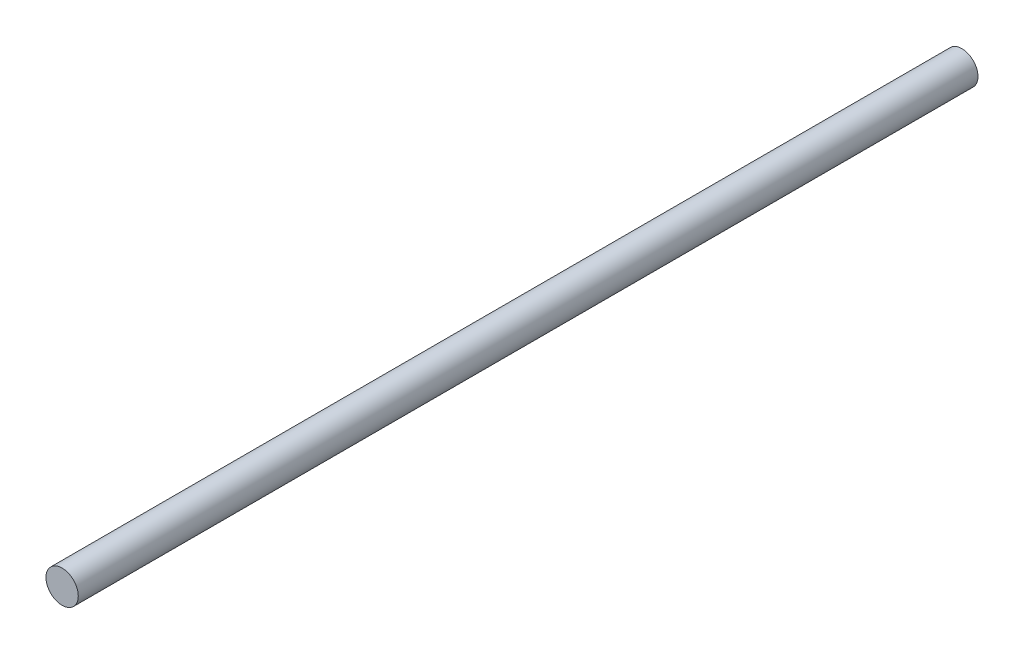
ISO-10303-21;
HEADER;
FILE_DESCRIPTION(('STEP AP214'),'2;1');
FILE_NAME('part.step','',(''),(''),'','','');
FILE_SCHEMA(('AUTOMOTIVE_DESIGN { 1 0 10303 214 1 1 1 1 }'));
ENDSEC;
DATA;
#1=APPLICATION_CONTEXT('core data for automotive mechanical design processes');
#2=APPLICATION_PROTOCOL_DEFINITION('international standard','automotive_design',2000,#1);
#3=PRODUCT_CONTEXT('',#1,'mechanical');
#4=PRODUCT('Part','Part','',(#3));
#5=PRODUCT_RELATED_PRODUCT_CATEGORY('part','',(#4));
#6=PRODUCT_DEFINITION_FORMATION('','',#4);
#7=PRODUCT_DEFINITION_CONTEXT('part definition',#1,'design');
#8=PRODUCT_DEFINITION('design','',#6,#7);
#9=PRODUCT_DEFINITION_SHAPE('','',#8);
#10=(LENGTH_UNIT() NAMED_UNIT(*) SI_UNIT(.MILLI.,.METRE.));
#11=(NAMED_UNIT(*) PLANE_ANGLE_UNIT() SI_UNIT($,.RADIAN.));
#12=(NAMED_UNIT(*) SI_UNIT($,.STERADIAN.) SOLID_ANGLE_UNIT());
#13=UNCERTAINTY_MEASURE_WITH_UNIT(LENGTH_MEASURE(1.E-05),#10,'distance_accuracy_value','');
#14=(GEOMETRIC_REPRESENTATION_CONTEXT(3) GLOBAL_UNCERTAINTY_ASSIGNED_CONTEXT((#13)) GLOBAL_UNIT_ASSIGNED_CONTEXT((#10,
#11,#12)) REPRESENTATION_CONTEXT('',''));
#15=CARTESIAN_POINT('',(0.,0.,0.));
#16=DIRECTION('',(0.,0.,1.));
#17=DIRECTION('',(1.,0.,0.));
#18=AXIS2_PLACEMENT_3D('',#15,#16,#17);
#19=CARTESIAN_POINT('',(0.,0.,2828.544));
#20=DIRECTION('',(0.,0.,-1.));
#21=DIRECTION('',(-1.,0.,0.));
#22=AXIS2_PLACEMENT_3D('',#19,#20,#21);
#23=CYLINDRICAL_SURFACE('',#22,50.8);
#24=CARTESIAN_POINT('',(0.,0.,2828.544));
#25=DIRECTION('',(0.,0.,1.));
#26=DIRECTION('',(1.,0.,0.));
#27=AXIS2_PLACEMENT_3D('',#24,#25,#26);
#28=CIRCLE('',#27,50.8);
#29=CARTESIAN_POINT('',(50.8,0.,2828.544));
#30=VERTEX_POINT('',#29);
#31=EDGE_CURVE('E10',#30,#30,#28,.T.);
#32=ORIENTED_EDGE('',*,*,#31,.F.);
#33=EDGE_LOOP('',(#32));
#34=FACE_BOUND('',#33,.T.);
#35=CARTESIAN_POINT('',(0.,0.,0.));
#36=DIRECTION('',(0.,0.,1.));
#37=DIRECTION('',(1.,0.,0.));
#38=AXIS2_PLACEMENT_3D('',#35,#36,#37);
#39=CIRCLE('',#38,50.8);
#40=CARTESIAN_POINT('',(50.8,0.,0.));
#41=VERTEX_POINT('',#40);
#42=EDGE_CURVE('E34',#41,#41,#39,.T.);
#43=ORIENTED_EDGE('',*,*,#42,.T.);
#44=EDGE_LOOP('',(#43));
#45=FACE_BOUND('',#44,.T.);
#46=ADVANCED_FACE('F31',(#34,#45),#23,.T.);
#47=CARTESIAN_POINT('',(0.,0.,2828.544));
#48=DIRECTION('',(0.,0.,1.));
#49=DIRECTION('',(1.,0.,0.));
#50=AXIS2_PLACEMENT_3D('',#47,#48,#49);
#51=PLANE('',#50);
#52=ORIENTED_EDGE('',*,*,#31,.T.);
#53=EDGE_LOOP('',(#52));
#54=FACE_BOUND('',#53,.T.);
#55=ADVANCED_FACE('F46',(#54),#51,.T.);
#56=CARTESIAN_POINT('',(0.,0.,0.));
#57=DIRECTION('',(0.,0.,1.));
#58=DIRECTION('',(1.,0.,0.));
#59=AXIS2_PLACEMENT_3D('',#56,#57,#58);
#60=PLANE('',#59);
#61=ORIENTED_EDGE('',*,*,#42,.F.);
#62=EDGE_LOOP('',(#61));
#63=FACE_BOUND('',#62,.T.);
#64=ADVANCED_FACE('F44',(#63),#60,.F.);
#65=CLOSED_SHELL('',(#46,#55,#64));
#66=MANIFOLD_SOLID_BREP('B2',#65);
#67=ADVANCED_BREP_SHAPE_REPRESENTATION('',(#18,#66),#14);
#68=SHAPE_DEFINITION_REPRESENTATION(#9,#67);
ENDSEC;
END-ISO-10303-21;
